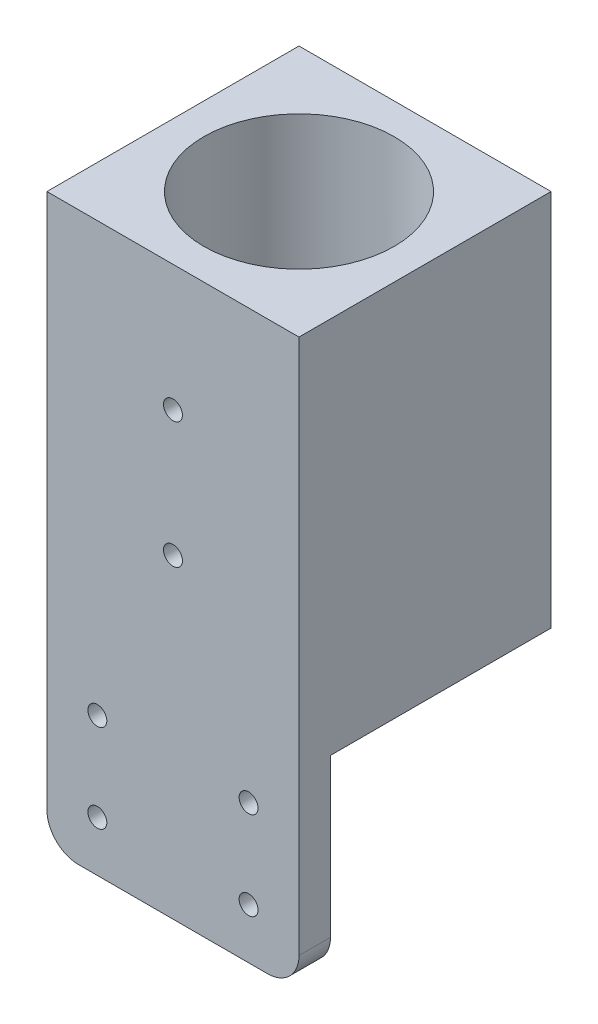
ISO-10303-21;
HEADER;
FILE_DESCRIPTION(('STEP AP214'),'2;1');
FILE_NAME('part.step','',(''),(''),'','','');
FILE_SCHEMA(('AUTOMOTIVE_DESIGN { 1 0 10303 214 1 1 1 1 }'));
ENDSEC;
DATA;
#1=APPLICATION_CONTEXT('core data for automotive mechanical design processes');
#2=APPLICATION_PROTOCOL_DEFINITION('international standard','automotive_design',2000,#1);
#3=PRODUCT_CONTEXT('',#1,'mechanical');
#4=PRODUCT('Part','Part','',(#3));
#5=PRODUCT_RELATED_PRODUCT_CATEGORY('part','',(#4));
#6=PRODUCT_DEFINITION_FORMATION('','',#4);
#7=PRODUCT_DEFINITION_CONTEXT('part definition',#1,'design');
#8=PRODUCT_DEFINITION('design','',#6,#7);
#9=PRODUCT_DEFINITION_SHAPE('','',#8);
#10=(LENGTH_UNIT() NAMED_UNIT(*) SI_UNIT(.MILLI.,.METRE.));
#11=(NAMED_UNIT(*) PLANE_ANGLE_UNIT() SI_UNIT($,.RADIAN.));
#12=(NAMED_UNIT(*) SI_UNIT($,.STERADIAN.) SOLID_ANGLE_UNIT());
#13=UNCERTAINTY_MEASURE_WITH_UNIT(LENGTH_MEASURE(1.E-05),#10,'distance_accuracy_value','');
#14=(GEOMETRIC_REPRESENTATION_CONTEXT(3) GLOBAL_UNCERTAINTY_ASSIGNED_CONTEXT((#13)) GLOBAL_UNIT_ASSIGNED_CONTEXT((#10,
#11,#12)) REPRESENTATION_CONTEXT('',''));
#15=CARTESIAN_POINT('',(0.,0.,0.));
#16=DIRECTION('',(0.,0.,1.));
#17=DIRECTION('',(1.,0.,0.));
#18=AXIS2_PLACEMENT_3D('',#15,#16,#17);
#19=CARTESIAN_POINT('',(20.,60.,-20.));
#20=DIRECTION('',(-1.,0.,0.));
#21=DIRECTION('',(0.,0.,1.));
#22=AXIS2_PLACEMENT_3D('',#19,#20,#21);
#23=PLANE('',#22);
#24=DIRECTION('',(0.,-1.,0.));
#25=VECTOR('',#24,1.);
#26=CARTESIAN_POINT('',(20.,60.,20.));
#27=LINE('',#26,#25);
#28=CARTESIAN_POINT('',(20.,60.,20.));
#29=VERTEX_POINT('',#28);
#30=CARTESIAN_POINT('',(20.,-25.,20.));
#31=VERTEX_POINT('',#30);
#32=EDGE_CURVE('E142',#29,#31,#27,.T.);
#33=ORIENTED_EDGE('',*,*,#32,.T.);
#34=DIRECTION('',(0.,0.,1.));
#35=VECTOR('',#34,1.);
#36=CARTESIAN_POINT('',(20.,-25.,15.));
#37=LINE('',#36,#35);
#38=CARTESIAN_POINT('',(20.,-25.,15.));
#39=VERTEX_POINT('',#38);
#40=EDGE_CURVE('E68',#31,#39,#37,.F.);
#41=ORIENTED_EDGE('',*,*,#40,.T.);
#42=DIRECTION('',(0.,1.,0.));
#43=VECTOR('',#42,1.);
#44=CARTESIAN_POINT('',(20.,0.,15.));
#45=LINE('',#44,#43);
#46=CARTESIAN_POINT('',(20.,0.,15.));
#47=VERTEX_POINT('',#46);
#48=EDGE_CURVE('E109',#39,#47,#45,.T.);
#49=ORIENTED_EDGE('',*,*,#48,.T.);
#50=DIRECTION('',(0.,0.,-1.));
#51=VECTOR('',#50,1.);
#52=CARTESIAN_POINT('',(20.,0.,-20.));
#53=LINE('',#52,#51);
#54=CARTESIAN_POINT('',(20.,0.,-20.));
#55=VERTEX_POINT('',#54);
#56=EDGE_CURVE('E113',#47,#55,#53,.T.);
#57=ORIENTED_EDGE('',*,*,#56,.T.);
#58=DIRECTION('',(0.,-1.,0.));
#59=VECTOR('',#58,1.);
#60=CARTESIAN_POINT('',(20.,60.,-20.));
#61=LINE('',#60,#59);
#62=CARTESIAN_POINT('',(20.,60.,-20.));
#63=VERTEX_POINT('',#62);
#64=EDGE_CURVE('E150',#63,#55,#61,.T.);
#65=ORIENTED_EDGE('',*,*,#64,.F.);
#66=DIRECTION('',(0.,0.,-1.));
#67=VECTOR('',#66,1.);
#68=CARTESIAN_POINT('',(20.,60.,-20.));
#69=LINE('',#68,#67);
#70=EDGE_CURVE('E141',#29,#63,#69,.T.);
#71=ORIENTED_EDGE('',*,*,#70,.F.);
#72=EDGE_LOOP('',(#33,#41,#49,#57,#65,#71));
#73=FACE_BOUND('',#72,.T.);
#74=ADVANCED_FACE('F38',(#73),#23,.F.);
#75=CARTESIAN_POINT('',(-20.,60.,-20.));
#76=DIRECTION('',(0.,0.,1.));
#77=DIRECTION('',(1.,0.,0.));
#78=AXIS2_PLACEMENT_3D('',#75,#76,#77);
#79=PLANE('',#78);
#80=CARTESIAN_POINT('',(0.,40.,-20.));
#81=DIRECTION('',(0.,0.,-1.));
#82=DIRECTION('',(-1.,0.,0.));
#83=AXIS2_PLACEMENT_3D('',#80,#81,#82);
#84=CIRCLE('',#83,1.5);
#85=CARTESIAN_POINT('',(-1.5,40.,-20.));
#86=VERTEX_POINT('',#85);
#87=EDGE_CURVE('E331',#86,#86,#84,.T.);
#88=ORIENTED_EDGE('',*,*,#87,.F.);
#89=EDGE_LOOP('',(#88));
#90=FACE_BOUND('',#89,.T.);
#91=CARTESIAN_POINT('',(0.,20.,-20.));
#92=DIRECTION('',(0.,0.,-1.));
#93=DIRECTION('',(-1.,0.,0.));
#94=AXIS2_PLACEMENT_3D('',#91,#92,#93);
#95=CIRCLE('',#94,1.5);
#96=CARTESIAN_POINT('',(-1.5,20.,-20.));
#97=VERTEX_POINT('',#96);
#98=EDGE_CURVE('E324',#97,#97,#95,.T.);
#99=ORIENTED_EDGE('',*,*,#98,.F.);
#100=EDGE_LOOP('',(#99));
#101=FACE_BOUND('',#100,.T.);
#102=DIRECTION('',(-1.,0.,0.));
#103=VECTOR('',#102,1.);
#104=CARTESIAN_POINT('',(-20.,0.,-20.));
#105=LINE('',#104,#103);
#106=CARTESIAN_POINT('',(-20.,0.,-20.));
#107=VERTEX_POINT('',#106);
#108=EDGE_CURVE('E128',#55,#107,#105,.T.);
#109=ORIENTED_EDGE('',*,*,#108,.T.);
#110=DIRECTION('',(0.,-1.,0.));
#111=VECTOR('',#110,1.);
#112=CARTESIAN_POINT('',(-20.,60.,-20.));
#113=LINE('',#112,#111);
#114=CARTESIAN_POINT('',(-20.,60.,-20.));
#115=VERTEX_POINT('',#114);
#116=EDGE_CURVE('E147',#115,#107,#113,.T.);
#117=ORIENTED_EDGE('',*,*,#116,.F.);
#118=DIRECTION('',(-1.,0.,0.));
#119=VECTOR('',#118,1.);
#120=CARTESIAN_POINT('',(-20.,60.,-20.));
#121=LINE('',#120,#119);
#122=EDGE_CURVE('E252',#63,#115,#121,.T.);
#123=ORIENTED_EDGE('',*,*,#122,.F.);
#124=ORIENTED_EDGE('',*,*,#64,.T.);
#125=EDGE_LOOP('',(#109,#117,#123,#124));
#126=FACE_BOUND('',#125,.T.);
#127=ADVANCED_FACE('F221',(#90,#101,#126),#79,.F.);
#128=CARTESIAN_POINT('',(-20.,60.,-20.));
#129=DIRECTION('',(1.,0.,0.));
#130=DIRECTION('',(0.,0.,-1.));
#131=AXIS2_PLACEMENT_3D('',#128,#129,#130);
#132=PLANE('',#131);
#133=DIRECTION('',(0.,-1.,0.));
#134=VECTOR('',#133,1.);
#135=CARTESIAN_POINT('',(-20.,0.,15.));
#136=LINE('',#135,#134);
#137=CARTESIAN_POINT('',(-20.,0.,15.));
#138=VERTEX_POINT('',#137);
#139=CARTESIAN_POINT('',(-20.,-25.,15.));
#140=VERTEX_POINT('',#139);
#141=EDGE_CURVE('E121',#138,#140,#136,.T.);
#142=ORIENTED_EDGE('',*,*,#141,.T.);
#143=DIRECTION('',(0.,0.,1.));
#144=VECTOR('',#143,1.);
#145=CARTESIAN_POINT('',(-20.,-25.,20.));
#146=LINE('',#145,#144);
#147=CARTESIAN_POINT('',(-20.,-25.,20.));
#148=VERTEX_POINT('',#147);
#149=EDGE_CURVE('E11',#140,#148,#146,.T.);
#150=ORIENTED_EDGE('',*,*,#149,.T.);
#151=DIRECTION('',(0.,-1.,0.));
#152=VECTOR('',#151,1.);
#153=CARTESIAN_POINT('',(-20.,60.,20.));
#154=LINE('',#153,#152);
#155=CARTESIAN_POINT('',(-20.,60.,20.));
#156=VERTEX_POINT('',#155);
#157=EDGE_CURVE('E144',#156,#148,#154,.T.);
#158=ORIENTED_EDGE('',*,*,#157,.F.);
#159=DIRECTION('',(0.,0.,1.));
#160=VECTOR('',#159,1.);
#161=CARTESIAN_POINT('',(-20.,60.,-20.));
#162=LINE('',#161,#160);
#163=EDGE_CURVE('E253',#115,#156,#162,.T.);
#164=ORIENTED_EDGE('',*,*,#163,.F.);
#165=ORIENTED_EDGE('',*,*,#116,.T.);
#166=DIRECTION('',(0.,0.,1.));
#167=VECTOR('',#166,1.);
#168=CARTESIAN_POINT('',(-20.,0.,-20.));
#169=LINE('',#168,#167);
#170=EDGE_CURVE('E132',#107,#138,#169,.T.);
#171=ORIENTED_EDGE('',*,*,#170,.T.);
#172=EDGE_LOOP('',(#142,#150,#158,#164,#165,#171));
#173=FACE_BOUND('',#172,.T.);
#174=ADVANCED_FACE('F226',(#173),#132,.F.);
#175=CARTESIAN_POINT('',(-20.,60.,20.));
#176=DIRECTION('',(0.,0.,-1.));
#177=DIRECTION('',(-1.,0.,0.));
#178=AXIS2_PLACEMENT_3D('',#175,#176,#177);
#179=PLANE('',#178);
#180=CARTESIAN_POINT('',(0.,40.,20.));
#181=DIRECTION('',(0.,0.,-1.));
#182=DIRECTION('',(-1.,0.,0.));
#183=AXIS2_PLACEMENT_3D('',#180,#181,#182);
#184=CIRCLE('',#183,1.5);
#185=CARTESIAN_POINT('',(-1.5,40.,20.));
#186=VERTEX_POINT('',#185);
#187=EDGE_CURVE('E321',#186,#186,#184,.T.);
#188=ORIENTED_EDGE('',*,*,#187,.T.);
#189=EDGE_LOOP('',(#188));
#190=FACE_BOUND('',#189,.T.);
#191=CARTESIAN_POINT('',(0.,20.,20.));
#192=DIRECTION('',(0.,0.,-1.));
#193=DIRECTION('',(-1.,0.,0.));
#194=AXIS2_PLACEMENT_3D('',#191,#192,#193);
#195=CIRCLE('',#194,1.5);
#196=CARTESIAN_POINT('',(-1.5,20.,20.));
#197=VERTEX_POINT('',#196);
#198=EDGE_CURVE('E172',#197,#197,#195,.T.);
#199=ORIENTED_EDGE('',*,*,#198,.T.);
#200=EDGE_LOOP('',(#199));
#201=FACE_BOUND('',#200,.T.);
#202=DIRECTION('',(1.,0.,0.));
#203=VECTOR('',#202,1.);
#204=CARTESIAN_POINT('',(-20.,-30.,20.));
#205=LINE('',#204,#203);
#206=CARTESIAN_POINT('',(-15.,-30.,20.));
#207=VERTEX_POINT('',#206);
#208=CARTESIAN_POINT('',(15.,-30.,20.));
#209=VERTEX_POINT('',#208);
#210=EDGE_CURVE('E242',#207,#209,#205,.T.);
#211=ORIENTED_EDGE('',*,*,#210,.T.);
#212=CARTESIAN_POINT('',(15.,-25.,20.));
#213=DIRECTION('',(0.,0.,-1.));
#214=DIRECTION('',(-1.,0.,0.));
#215=AXIS2_PLACEMENT_3D('',#212,#213,#214);
#216=CIRCLE('',#215,5.);
#217=EDGE_CURVE('E159',#209,#31,#216,.F.);
#218=ORIENTED_EDGE('',*,*,#217,.T.);
#219=ORIENTED_EDGE('',*,*,#32,.F.);
#220=DIRECTION('',(1.,0.,0.));
#221=VECTOR('',#220,1.);
#222=CARTESIAN_POINT('',(-20.,60.,20.));
#223=LINE('',#222,#221);
#224=EDGE_CURVE('E137',#156,#29,#223,.T.);
#225=ORIENTED_EDGE('',*,*,#224,.F.);
#226=ORIENTED_EDGE('',*,*,#157,.T.);
#227=CARTESIAN_POINT('',(-15.,-25.,20.));
#228=DIRECTION('',(0.,0.,-1.));
#229=DIRECTION('',(-1.,0.,0.));
#230=AXIS2_PLACEMENT_3D('',#227,#228,#229);
#231=CIRCLE('',#230,5.);
#232=EDGE_CURVE('E157',#148,#207,#231,.F.);
#233=ORIENTED_EDGE('',*,*,#232,.T.);
#234=EDGE_LOOP('',(#211,#218,#219,#225,#226,#233));
#235=FACE_BOUND('',#234,.T.);
#236=CARTESIAN_POINT('',(12.,-8.,20.));
#237=DIRECTION('',(0.,0.,1.));
#238=DIRECTION('',(-1.,0.,0.));
#239=AXIS2_PLACEMENT_3D('',#236,#237,#238);
#240=CIRCLE('',#239,1.5);
#241=CARTESIAN_POINT('',(10.5,-8.,20.));
#242=VERTEX_POINT('',#241);
#243=EDGE_CURVE('E345',#242,#242,#240,.T.);
#244=ORIENTED_EDGE('',*,*,#243,.F.);
#245=EDGE_LOOP('',(#244));
#246=FACE_BOUND('',#245,.T.);
#247=CARTESIAN_POINT('',(12.,-22.,20.));
#248=DIRECTION('',(0.,0.,1.));
#249=DIRECTION('',(-1.,0.,0.));
#250=AXIS2_PLACEMENT_3D('',#247,#248,#249);
#251=CIRCLE('',#250,1.5);
#252=CARTESIAN_POINT('',(10.5,-22.,20.));
#253=VERTEX_POINT('',#252);
#254=EDGE_CURVE('E344',#253,#253,#251,.T.);
#255=ORIENTED_EDGE('',*,*,#254,.F.);
#256=EDGE_LOOP('',(#255));
#257=FACE_BOUND('',#256,.T.);
#258=CARTESIAN_POINT('',(-12.,-22.,20.));
#259=DIRECTION('',(0.,0.,1.));
#260=DIRECTION('',(1.,0.,0.));
#261=AXIS2_PLACEMENT_3D('',#258,#259,#260);
#262=CIRCLE('',#261,1.5);
#263=CARTESIAN_POINT('',(-10.5,-22.,20.));
#264=VERTEX_POINT('',#263);
#265=EDGE_CURVE('E351',#264,#264,#262,.T.);
#266=ORIENTED_EDGE('',*,*,#265,.F.);
#267=EDGE_LOOP('',(#266));
#268=FACE_BOUND('',#267,.T.);
#269=CARTESIAN_POINT('',(-12.,-8.,20.));
#270=DIRECTION('',(0.,0.,1.));
#271=DIRECTION('',(1.,0.,0.));
#272=AXIS2_PLACEMENT_3D('',#269,#270,#271);
#273=CIRCLE('',#272,1.5);
#274=CARTESIAN_POINT('',(-10.5,-8.,20.));
#275=VERTEX_POINT('',#274);
#276=EDGE_CURVE('E357',#275,#275,#273,.T.);
#277=ORIENTED_EDGE('',*,*,#276,.F.);
#278=EDGE_LOOP('',(#277));
#279=FACE_BOUND('',#278,.T.);
#280=ADVANCED_FACE('F262',(#190,#201,#235,#246,#257,#268,#279),#179,.F.);
#281=CARTESIAN_POINT('',(0.,60.,0.));
#282=DIRECTION('',(0.,1.,0.));
#283=DIRECTION('',(0.,0.,1.));
#284=AXIS2_PLACEMENT_3D('',#281,#282,#283);
#285=PLANE('',#284);
#286=CARTESIAN_POINT('',(0.,60.,0.));
#287=DIRECTION('',(0.,1.,0.));
#288=DIRECTION('',(0.,0.,1.));
#289=AXIS2_PLACEMENT_3D('',#286,#287,#288);
#290=CIRCLE('',#289,15.1);
#291=CARTESIAN_POINT('',(0.,60.,15.1));
#292=VERTEX_POINT('',#291);
#293=EDGE_CURVE('E125',#292,#292,#290,.T.);
#294=ORIENTED_EDGE('',*,*,#293,.F.);
#295=EDGE_LOOP('',(#294));
#296=FACE_BOUND('',#295,.T.);
#297=ORIENTED_EDGE('',*,*,#70,.T.);
#298=ORIENTED_EDGE('',*,*,#122,.T.);
#299=ORIENTED_EDGE('',*,*,#163,.T.);
#300=ORIENTED_EDGE('',*,*,#224,.T.);
#301=EDGE_LOOP('',(#297,#298,#299,#300));
#302=FACE_BOUND('',#301,.T.);
#303=ADVANCED_FACE('F259',(#296,#302),#285,.T.);
#304=CARTESIAN_POINT('',(0.,0.,0.));
#305=DIRECTION('',(0.,1.,0.));
#306=DIRECTION('',(0.,0.,1.));
#307=AXIS2_PLACEMENT_3D('',#304,#305,#306);
#308=PLANE('',#307);
#309=ORIENTED_EDGE('',*,*,#56,.F.);
#310=DIRECTION('',(-1.,0.,0.));
#311=VECTOR('',#310,1.);
#312=CARTESIAN_POINT('',(-20.,0.,15.));
#313=LINE('',#312,#311);
#314=EDGE_CURVE('E116',#47,#138,#313,.T.);
#315=ORIENTED_EDGE('',*,*,#314,.T.);
#316=ORIENTED_EDGE('',*,*,#170,.F.);
#317=ORIENTED_EDGE('',*,*,#108,.F.);
#318=EDGE_LOOP('',(#309,#315,#316,#317));
#319=FACE_BOUND('',#318,.T.);
#320=ADVANCED_FACE('F127',(#319),#308,.F.);
#321=CARTESIAN_POINT('',(0.,9.99999999999999,0.));
#322=DIRECTION('',(0.,1.,0.));
#323=DIRECTION('',(0.,0.,1.));
#324=AXIS2_PLACEMENT_3D('',#321,#322,#323);
#325=CYLINDRICAL_SURFACE('',#324,15.1);
#326=CARTESIAN_POINT('',(0.,38.5,15.1));
#327=CARTESIAN_POINT('',(0.0840334913134179,38.5000036404221,15.0999990385374));
#328=CARTESIAN_POINT('',(0.168122612271099,38.5070854017001,15.0992910588697));
#329=CARTESIAN_POINT('',(0.333969778942404,38.5352291424973,15.0965348658164));
#330=CARTESIAN_POINT('',(0.415725149462323,38.5563065430931,15.0944851741027));
#331=CARTESIAN_POINT('',(0.574479156345273,38.6118220900159,15.0892769412067));
#332=CARTESIAN_POINT('',(0.65148062540209,38.6462521890749,15.0861190680008));
#333=CARTESIAN_POINT('',(0.798594736012719,38.7274802225141,15.079047622128));
#334=CARTESIAN_POINT('',(0.868708748074065,38.774275689493,15.0751342002662));
#335=CARTESIAN_POINT('',(1.00032367741318,38.8790846150748,15.0669745163323));
#336=CARTESIAN_POINT('',(1.06179668932916,38.9371330405989,15.0627272419762));
#337=CARTESIAN_POINT('',(1.1741448027792,39.0627255534249,15.0543869234307));
#338=CARTESIAN_POINT('',(1.22501941520662,39.1302700787224,15.0502938863663));
#339=CARTESIAN_POINT('',(1.31482520757763,39.2731118324098,15.0427150913587));
#340=CARTESIAN_POINT('',(1.35373117004318,39.348424989481,15.0392306222273));
#341=CARTESIAN_POINT('',(1.41833423838203,39.5045556682962,15.0332759806482));
#342=CARTESIAN_POINT('',(1.4440316665615,39.5853730556749,15.0308057834512));
#343=CARTESIAN_POINT('',(1.48140556837627,39.7499337344833,15.0271684823504));
#344=CARTESIAN_POINT('',(1.49312828444902,39.8336664270807,15.0259970816232));
#345=CARTESIAN_POINT('',(1.50236293710448,40.001918422725,15.0250766488671));
#346=CARTESIAN_POINT('',(1.49987524258122,40.0864377052958,15.0253275799154));
#347=CARTESIAN_POINT('',(1.48079780989317,40.2535450039719,15.0272195363062));
#348=CARTESIAN_POINT('',(1.46425855235936,40.3361388473433,15.0288555854999));
#349=CARTESIAN_POINT('',(1.41762602385058,40.4973725739407,15.0333256610411));
#350=CARTESIAN_POINT('',(1.38753257195448,40.5760124043729,15.0361597033794));
#351=CARTESIAN_POINT('',(1.31459014210282,40.7272653329698,15.0427121640719));
#352=CARTESIAN_POINT('',(1.27171875672147,40.7998675551162,15.0464321336688));
#353=CARTESIAN_POINT('',(1.17445352525687,40.9368653451612,15.0543359823205));
#354=CARTESIAN_POINT('',(1.12005934640686,41.001260675967,15.0585198747712));
#355=CARTESIAN_POINT('',(1.00101058139794,41.1203100847149,15.0669023190288));
#356=CARTESIAN_POINT('',(0.936312397049685,41.1749205752739,15.0711008554459));
#357=CARTESIAN_POINT('',(0.798643586722281,41.2725123113185,15.0790223240295));
#358=CARTESIAN_POINT('',(0.725672951653204,41.3154935440254,15.0827452556733));
#359=CARTESIAN_POINT('',(0.573500490253151,41.3886048950031,15.0892972400823));
#360=CARTESIAN_POINT('',(0.494297600223146,41.4187328138565,15.0921261398421));
#361=CARTESIAN_POINT('',(0.331923094472873,41.465250432226,15.0965697472753));
#362=CARTESIAN_POINT('',(0.248751595941156,41.4816405371393,15.0981844907777));
#363=CARTESIAN_POINT('',(0.0811782907909115,41.5001620044192,15.1000132436603));
#364=CARTESIAN_POINT('',(-0.00321680580619617,41.5023535167337,15.1002331618995));
#365=CARTESIAN_POINT('',(-0.17117309714296,41.4925735544574,15.0992633266477));
#366=CARTESIAN_POINT('',(-0.254734302982333,41.4806022686384,15.0980735919457));
#367=CARTESIAN_POINT('',(-0.418477297188524,41.4428864297211,15.094421935124));
#368=CARTESIAN_POINT('',(-0.498665632696482,41.4171700279009,15.0919626135869));
#369=CARTESIAN_POINT('',(-0.653590115846393,41.352722874355,15.0860477033924));
#370=CARTESIAN_POINT('',(-0.728326142734376,41.3139918344966,15.0825920926784));
#371=CARTESIAN_POINT('',(-0.870496559732581,41.2244655796339,15.0750564574029));
#372=CARTESIAN_POINT('',(-0.937905945929514,41.1736308312894,15.0709744026046));
#373=CARTESIAN_POINT('',(-1.06325650508847,41.0613968742776,15.0626504847039));
#374=CARTESIAN_POINT('',(-1.12119744352501,40.9999974040082,15.0584086176461));
#375=CARTESIAN_POINT('',(-1.22617511515132,40.8681145192309,15.0502253959363));
#376=CARTESIAN_POINT('',(-1.27317238166337,40.7975996102185,15.0462851623372));
#377=CARTESIAN_POINT('',(-1.35465734674598,40.6496429121308,15.0391683148233));
#378=CARTESIAN_POINT('',(-1.38914521442673,40.5722012167141,15.0359916905858));
#379=CARTESIAN_POINT('',(-1.44456627768245,40.4127247712406,15.0307686796749));
#380=CARTESIAN_POINT('',(-1.46552298521954,40.3306982588719,15.0287203334026));
#381=CARTESIAN_POINT('',(-1.49336314220043,40.1642693006581,15.0259796800411));
#382=CARTESIAN_POINT('',(-1.50024698946219,40.0798669220435,15.02528733462));
#383=CARTESIAN_POINT('',(-1.49974053707664,39.9114743785095,15.0253378642764));
#384=CARTESIAN_POINT('',(-1.49241223531713,39.827484018372,15.0260745056653));
#385=CARTESIAN_POINT('',(-1.46381946909954,39.6619338532663,15.0288867174114));
#386=CARTESIAN_POINT('',(-1.44255498869214,39.5803740510799,15.0309622893009));
#387=CARTESIAN_POINT('',(-1.38671053047343,39.4220004570126,15.0362167706571));
#388=CARTESIAN_POINT('',(-1.35213234173957,39.3451860290637,15.0393955318731));
#389=CARTESIAN_POINT('',(-1.27064843524865,39.1984414238663,15.0464985217679));
#390=CARTESIAN_POINT('',(-1.22374279185676,39.1285112050923,15.0504227459497));
#391=CARTESIAN_POINT('',(-1.1187026177464,38.9972023631535,15.0585949976822));
#392=CARTESIAN_POINT('',(-1.06052189971375,38.9358607666275,15.0628443120482));
#393=CARTESIAN_POINT('',(-0.934674232976564,38.8237838169193,15.071176202781));
#394=CARTESIAN_POINT('',(-0.867005014379293,38.7730510088878,15.0752587389475));
#395=CARTESIAN_POINT('',(-0.72391737866919,38.6835327851689,15.0828076107449));
#396=CARTESIAN_POINT('',(-0.648480091437878,38.6447774234414,15.0862723872249));
#397=CARTESIAN_POINT('',(-0.492182552368615,38.5805354303454,15.0921783482185));
#398=CARTESIAN_POINT('',(-0.411328537093085,38.5550338258457,15.094620687198));
#399=CARTESIAN_POINT('',(-0.275013323678494,38.5243879414083,15.0975923352258));
#400=CARTESIAN_POINT('',(-0.220423739200682,38.5152549446227,15.0984910035701));
#401=CARTESIAN_POINT('',(-0.110564129872748,38.5030597885313,15.0996951510757));
#402=CARTESIAN_POINT('',(-0.0552941077837321,38.4999976045992,15.1000006326432));
#403=CARTESIAN_POINT('',(0.,38.5,15.1));
#404=B_SPLINE_CURVE_WITH_KNOTS('',3,(#326,#327,#328,#329,#330,#331,#332,#333,#334,#335,#336,
#337,#338,#339,#340,#341,#342,#343,#344,#345,#346,#347,#348,#349,#350,#351,#352,#353,#354,#355,
#356,#357,#358,#359,#360,#361,#362,#363,#364,#365,#366,#367,#368,#369,#370,#371,#372,#373,#374,
#375,#376,#377,#378,#379,#380,#381,#382,#383,#384,#385,#386,#387,#388,#389,#390,#391,#392,#393,
#394,#395,#396,#397,#398,#399,#400,#401,#402,#403),.UNSPECIFIED.,.T.,.F.,(4,2,2,2,2,2,2,2,2,2,2,
2,2,2,2,2,2,2,2,2,2,2,2,2,2,2,2,2,2,2,2,2,2,2,2,2,2,2,4),(0.,0.251898561752107,
0.504075139190921,0.756099973007817,1.00807455539026,1.26084503944546,1.5136271860493,
1.7669383435121,2.0202433195452,2.27270775987047,2.52516564639505,2.7767203875183,
3.02827848648904,3.28028034030049,3.53228947266614,3.78539470806764,4.03850022158875,
4.29164902834897,4.54479036452968,4.79685860493316,5.04892348563007,5.30047408114897,
5.55203024614672,5.80441960023737,6.05681520485256,6.31010740602286,6.56339618289677,
6.81624364816236,7.06908396572312,7.32082379450776,7.57256391139745,7.82427021160308,
8.07597499342963,8.32873352994787,8.58155263628128,8.83500106334172,9.08816253697278,
9.25391267430062,9.41966213926263),.UNSPECIFIED.);
#405=CARTESIAN_POINT('',(0.,38.5,15.1));
#406=VERTEX_POINT('',#405);
#407=EDGE_CURVE('E42',#406,#406,#404,.T.);
#408=ORIENTED_EDGE('',*,*,#407,.T.);
#409=EDGE_LOOP('',(#408));
#410=FACE_BOUND('',#409,.T.);
#411=CARTESIAN_POINT('',(-1.5,40.,-15.0253119767944));
#412=CARTESIAN_POINT('',(-1.49999635854613,40.0840323379081,-15.025312956074));
#413=CARTESIAN_POINT('',(-1.49291478510043,40.1681203090886,-15.0260245276725));
#414=CARTESIAN_POINT('',(-1.46477185820528,40.3339650868479,-15.028793551497));
#415=CARTESIAN_POINT('',(-1.44369507968879,40.4157192173295,-15.03085248871));
#416=CARTESIAN_POINT('',(-1.38818135253405,40.5744706021013,-15.0360807748948));
#417=CARTESIAN_POINT('',(-1.35375248074173,40.6514706995853,-15.0392494524589));
#418=CARTESIAN_POINT('',(-1.27252733745513,40.798582511939,-15.0463393621317));
#419=CARTESIAN_POINT('',(-1.22573353035035,40.8686955956076,-15.05026044424));
#420=CARTESIAN_POINT('',(-1.12092628167147,41.0003115728581,-15.0584291270942));
#421=CARTESIAN_POINT('',(-1.06287750232365,41.0617862671161,-15.0626777301768));
#422=CARTESIAN_POINT('',(-0.937283575420636,41.1741376276325,-15.0710136412484));
#423=CARTESIAN_POINT('',(-0.869737994461098,41.2250138099448,-15.0751009418651));
#424=CARTESIAN_POINT('',(-0.726895315412322,41.3148212442856,-15.0826635983521));
#425=CARTESIAN_POINT('',(-0.651582470180895,41.3537275670679,-15.0861376707466));
#426=CARTESIAN_POINT('',(-0.495452469131726,41.4183313875751,-15.0920715347339));
#427=CARTESIAN_POINT('',(-0.414635445899538,41.4440292033412,-15.0945313507482));
#428=CARTESIAN_POINT('',(-0.250075883600478,41.4814039145561,-15.0981525138302));
#429=CARTESIAN_POINT('',(-0.166343950618247,41.4931270865079,-15.0993181456551));
#430=CARTESIAN_POINT('',(0.00190655759439105,41.5023629141085,-15.100234174601));
#431=CARTESIAN_POINT('',(0.0864251126221092,41.4998759337144,-15.0999846079687));
#432=CARTESIAN_POINT('',(0.25353556043428,41.4807996317617,-15.0981018679929));
#433=CARTESIAN_POINT('',(0.336133196401711,41.4642600719598,-15.0964735769364));
#434=CARTESIAN_POINT('',(0.49737435212394,41.4176256243436,-15.0920219994832));
#435=CARTESIAN_POINT('',(0.576017821082987,41.387530562443,-15.0891986977396));
#436=CARTESIAN_POINT('',(0.727275160741128,41.314584798763,-15.0826661343107));
#437=CARTESIAN_POINT('',(0.799878337650497,41.2717120651685,-15.0789553445811));
#438=CARTESIAN_POINT('',(0.936877465459624,41.1744439561001,-15.0710642123586));
#439=CARTESIAN_POINT('',(1.00127317876582,41.120048247175,-15.0668838562791));
#440=CARTESIAN_POINT('',(1.12032085957512,41.0009983967895,-15.0585014337633));
#441=CARTESIAN_POINT('',(1.17492954862421,40.9363009695517,-15.054299351531));
#442=CARTESIAN_POINT('',(1.27251801061355,40.798634315922,-15.0463651004589));
#443=CARTESIAN_POINT('',(1.31549776704826,40.7256650777897,-15.0426329322861));
#444=CARTESIAN_POINT('',(1.38860805601259,40.573492994915,-15.0360607178808));
#445=CARTESIAN_POINT('',(1.41873593323833,40.494288865993,-15.0332208560381));
#446=CARTESIAN_POINT('',(1.46525308871646,40.3319116673364,-15.0287585753405));
#447=CARTESIAN_POINT('',(1.48164277988374,40.2487387169679,-15.0271361198954));
#448=CARTESIAN_POINT('',(1.50016268663854,40.0811647363099,-15.0252986591232));
#449=CARTESIAN_POINT('',(1.50235344042828,39.9967704594153,-15.0250776785925));
#450=CARTESIAN_POINT('',(1.49257225368717,39.8288159897031,-15.0260524182927));
#451=CARTESIAN_POINT('',(1.48060050195128,39.7452557857818,-15.0272481196383));
#452=CARTESIAN_POINT('',(1.44288477969783,39.5815177761309,-15.0309160596127));
#453=CARTESIAN_POINT('',(1.41716941799686,39.5013333161148,-15.0333856461404));
#454=CARTESIAN_POINT('',(1.35272564260952,39.3464161237869,-15.0393209391003));
#455=CARTESIAN_POINT('',(1.31399693465547,39.2716835148031,-15.0427866680578));
#456=CARTESIAN_POINT('',(1.2244741127262,39.1295154277819,-15.0503382064572));
#457=CARTESIAN_POINT('',(1.17363987299589,39.0621053271485,-15.0544260614167));
#458=CARTESIAN_POINT('',(1.06140651663175,38.9367530895975,-15.0627545443571));
#459=CARTESIAN_POINT('',(1.00000714187558,38.8788111840697,-15.0669951760684));
#460=CARTESIAN_POINT('',(0.868123835144985,38.7738314209589,-15.0751694218504));
#461=CARTESIAN_POINT('',(0.797608391658787,38.7268330489097,-15.0791018911967));
#462=CARTESIAN_POINT('',(0.649650329668305,38.6453461441191,-15.0862000664518));
#463=CARTESIAN_POINT('',(0.572207805008103,38.610857441936,-15.0893657827459));
#464=CARTESIAN_POINT('',(0.412731881610149,38.5554358271819,-15.0945685839412));
#465=CARTESIAN_POINT('',(0.33070684694006,38.5344790410605,-15.0966076555916));
#466=CARTESIAN_POINT('',(0.164281005364228,38.5066382262014,-15.099335565752));
#467=CARTESIAN_POINT('',(0.0798802643504136,38.4997538075456,-15.1000244416734));
#468=CARTESIAN_POINT('',(-0.0885132586038646,38.5002585923235,-15.0999743264919));
#469=CARTESIAN_POINT('',(-0.172506232884099,38.5075864877595,-15.0992414683536));
#470=CARTESIAN_POINT('',(-0.338061727779915,38.5361793609014,-15.096442335095));
#471=CARTESIAN_POINT('',(-0.419624246419132,38.5574443499401,-15.0943760588904));
#472=CARTESIAN_POINT('',(-0.578003288244202,38.6132908511903,-15.0891416171645));
#473=CARTESIAN_POINT('',(-0.654820438508599,38.6478705995307,-15.0859735976019));
#474=CARTESIAN_POINT('',(-0.801569837575123,38.7293584680913,-15.078888864656));
#475=CARTESIAN_POINT('',(-0.871502129590264,38.7762665109258,-15.0749721559724));
#476=CARTESIAN_POINT('',(-1.00281085394436,38.8813093254985,-15.0668086636542));
#477=CARTESIAN_POINT('',(-1.06415069694839,38.9394897356781,-15.0625605816352));
#478=CARTESIAN_POINT('',(-1.17622425255196,39.0653360650132,-15.0542241088092));
#479=CARTESIAN_POINT('',(-1.22695541540431,39.1330042580001,-15.050135756584));
#480=CARTESIAN_POINT('',(-1.31647186691678,39.2760910566375,-15.042570630608));
#481=CARTESIAN_POINT('',(-1.35522680653066,39.3515287170159,-15.0390954200226));
#482=CARTESIAN_POINT('',(-1.41946790711139,39.5078270472788,-15.0331686996374));
#483=CARTESIAN_POINT('',(-1.444969046934,39.5886814781435,-15.0307160348248));
#484=CARTESIAN_POINT('',(-1.47561362318629,39.7249954485645,-15.0277311589647));
#485=CARTESIAN_POINT('',(-1.48474603116336,39.7795832819967,-15.0268282506956));
#486=CARTESIAN_POINT('',(-1.49694040505908,39.8894393833602,-15.0256183386627));
#487=CARTESIAN_POINT('',(-1.50000239603648,39.9447076484818,-15.0253113324391));
#488=CARTESIAN_POINT('',(-1.5,40.,-15.0253119767944));
#489=B_SPLINE_CURVE_WITH_KNOTS('',3,(#411,#412,#413,#414,#415,#416,#417,#418,#419,#420,#421,
#422,#423,#424,#425,#426,#427,#428,#429,#430,#431,#432,#433,#434,#435,#436,#437,#438,#439,#440,
#441,#442,#443,#444,#445,#446,#447,#448,#449,#450,#451,#452,#453,#454,#455,#456,#457,#458,#459,
#460,#461,#462,#463,#464,#465,#466,#467,#468,#469,#470,#471,#472,#473,#474,#475,#476,#477,#478,
#479,#480,#481,#482,#483,#484,#485,#486,#487,#488),.UNSPECIFIED.,.T.,.F.,(4,2,2,2,2,2,2,2,2,2,2,
2,2,2,2,2,2,2,2,2,2,2,2,2,2,2,2,2,2,2,2,2,2,2,2,2,2,2,4),(0.,0.251895097196481,0.50406828696038,
0.75608917138904,1.00805986471088,1.26083488254587,1.51362143998953,1.76693095868192,
2.02023437776912,2.27269664114699,2.52515243837155,2.77671796950038,3.02828673144791,
3.28029179364622,3.53230414935095,3.7854047994611,4.03850580880849,4.29165908560718,
4.54480475335873,4.79687040216313,5.04893269081456,5.30047231646477,5.552017630503,
5.80440863162633,6.05680579992193,6.310100003098,6.56339077531053,6.81623345189484,
7.06906912260185,7.32081655553195,7.57256419316888,7.82427849203737,8.07599121091297,
8.32874517901134,8.58155982571251,8.83500997565596,9.08817306120623,9.25391794111063,
9.41966213681694),.UNSPECIFIED.);
#490=CARTESIAN_POINT('',(-1.5,40.,-15.0253119767944));
#491=VERTEX_POINT('',#490);
#492=EDGE_CURVE('E325',#491,#491,#489,.T.);
#493=ORIENTED_EDGE('',*,*,#492,.T.);
#494=EDGE_LOOP('',(#493));
#495=FACE_BOUND('',#494,.T.);
#496=CARTESIAN_POINT('',(0.,18.5,15.1));
#497=CARTESIAN_POINT('',(0.0840334913134179,18.5000036404221,15.0999990385374));
#498=CARTESIAN_POINT('',(0.168122612271099,18.5070854017001,15.0992910588697));
#499=CARTESIAN_POINT('',(0.333969778942404,18.5352291424973,15.0965348658164));
#500=CARTESIAN_POINT('',(0.415725149462323,18.5563065430931,15.0944851741027));
#501=CARTESIAN_POINT('',(0.574479156345272,18.6118220900159,15.0892769412067));
#502=CARTESIAN_POINT('',(0.65148062540209,18.6462521890749,15.0861190680008));
#503=CARTESIAN_POINT('',(0.798594736012718,18.7274802225141,15.079047622128));
#504=CARTESIAN_POINT('',(0.868708748074066,18.774275689493,15.0751342002662));
#505=CARTESIAN_POINT('',(1.00032367741319,18.8790846150748,15.0669745163323));
#506=CARTESIAN_POINT('',(1.06179668932917,18.9371330405989,15.0627272419762));
#507=CARTESIAN_POINT('',(1.1741448027792,19.0627255534249,15.0543869234307));
#508=CARTESIAN_POINT('',(1.22501941520662,19.1302700787224,15.0502938863663));
#509=CARTESIAN_POINT('',(1.31482520757763,19.2731118324098,15.0427150913587));
#510=CARTESIAN_POINT('',(1.35373117004318,19.348424989481,15.0392306222273));
#511=CARTESIAN_POINT('',(1.41833423838203,19.5045556682962,15.0332759806482));
#512=CARTESIAN_POINT('',(1.4440316665615,19.5853730556749,15.0308057834512));
#513=CARTESIAN_POINT('',(1.48140556837627,19.7499337344833,15.0271684823504));
#514=CARTESIAN_POINT('',(1.49312828444902,19.8336664270807,15.0259970816232));
#515=CARTESIAN_POINT('',(1.50236293710448,20.001918422725,15.0250766488671));
#516=CARTESIAN_POINT('',(1.49987524258122,20.0864377052958,15.0253275799154));
#517=CARTESIAN_POINT('',(1.48079780989317,20.2535450039719,15.0272195363062));
#518=CARTESIAN_POINT('',(1.46425855235936,20.3361388473433,15.0288555854999));
#519=CARTESIAN_POINT('',(1.41762602385059,20.4973725739407,15.0333256610411));
#520=CARTESIAN_POINT('',(1.38753257195448,20.5760124043729,15.0361597033794));
#521=CARTESIAN_POINT('',(1.31459014210282,20.7272653329698,15.0427121640719));
#522=CARTESIAN_POINT('',(1.27171875672147,20.7998675551162,15.0464321336688));
#523=CARTESIAN_POINT('',(1.17445352525687,20.9368653451612,15.0543359823205));
#524=CARTESIAN_POINT('',(1.12005934640686,21.001260675967,15.0585198747712));
#525=CARTESIAN_POINT('',(1.00101058139794,21.1203100847149,15.0669023190288));
#526=CARTESIAN_POINT('',(0.936312397049684,21.1749205752739,15.0711008554459));
#527=CARTESIAN_POINT('',(0.798643586722277,21.2725123113185,15.0790223240295));
#528=CARTESIAN_POINT('',(0.7256729516532,21.3154935440254,15.0827452556733));
#529=CARTESIAN_POINT('',(0.573500490253146,21.3886048950031,15.0892972400823));
#530=CARTESIAN_POINT('',(0.494297600223142,21.4187328138565,15.0921261398421));
#531=CARTESIAN_POINT('',(0.33192309447287,21.465250432226,15.0965697472753));
#532=CARTESIAN_POINT('',(0.248751595941155,21.4816405371393,15.0981844907777));
#533=CARTESIAN_POINT('',(0.0811782907909112,21.5001620044192,15.1000132436603));
#534=CARTESIAN_POINT('',(-0.00321680580619642,21.5023535167337,15.1002331618995));
#535=CARTESIAN_POINT('',(-0.17117309714296,21.4925735544574,15.0992633266477));
#536=CARTESIAN_POINT('',(-0.254734302982333,21.4806022686384,15.0980735919457));
#537=CARTESIAN_POINT('',(-0.418477297188525,21.4428864297211,15.094421935124));
#538=CARTESIAN_POINT('',(-0.498665632696483,21.4171700279009,15.0919626135869));
#539=CARTESIAN_POINT('',(-0.653590115846393,21.352722874355,15.0860477033924));
#540=CARTESIAN_POINT('',(-0.728326142734376,21.3139918344966,15.0825920926784));
#541=CARTESIAN_POINT('',(-0.870496559732581,21.2244655796339,15.0750564574029));
#542=CARTESIAN_POINT('',(-0.937905945929515,21.1736308312894,15.0709744026046));
#543=CARTESIAN_POINT('',(-1.06325650508847,21.0613968742776,15.0626504847039));
#544=CARTESIAN_POINT('',(-1.12119744352501,20.9999974040082,15.0584086176461));
#545=CARTESIAN_POINT('',(-1.22617511515132,20.8681145192309,15.0502253959363));
#546=CARTESIAN_POINT('',(-1.27317238166337,20.7975996102185,15.0462851623372));
#547=CARTESIAN_POINT('',(-1.35465734674598,20.6496429121308,15.0391683148233));
#548=CARTESIAN_POINT('',(-1.38914521442673,20.5722012167141,15.0359916905858));
#549=CARTESIAN_POINT('',(-1.44456627768245,20.4127247712406,15.0307686796749));
#550=CARTESIAN_POINT('',(-1.46552298521954,20.3306982588719,15.0287203334026));
#551=CARTESIAN_POINT('',(-1.49336314220043,20.1642693006581,15.0259796800411));
#552=CARTESIAN_POINT('',(-1.50024698946219,20.0798669220435,15.02528733462));
#553=CARTESIAN_POINT('',(-1.49974053707664,19.9114743785095,15.0253378642764));
#554=CARTESIAN_POINT('',(-1.49241223531713,19.827484018372,15.0260745056653));
#555=CARTESIAN_POINT('',(-1.46381946909954,19.6619338532663,15.0288867174114));
#556=CARTESIAN_POINT('',(-1.44255498869214,19.5803740510799,15.0309622893009));
#557=CARTESIAN_POINT('',(-1.38671053047343,19.4220004570126,15.0362167706571));
#558=CARTESIAN_POINT('',(-1.35213234173957,19.3451860290637,15.0393955318731));
#559=CARTESIAN_POINT('',(-1.27064843524865,19.1984414238662,15.0464985217679));
#560=CARTESIAN_POINT('',(-1.22374279185675,19.1285112050923,15.0504227459497));
#561=CARTESIAN_POINT('',(-1.1187026177464,18.9972023631535,15.0585949976822));
#562=CARTESIAN_POINT('',(-1.06052189971374,18.9358607666275,15.0628443120482));
#563=CARTESIAN_POINT('',(-0.934674232976556,18.8237838169193,15.071176202781));
#564=CARTESIAN_POINT('',(-0.867005014379288,18.7730510088878,15.0752587389475));
#565=CARTESIAN_POINT('',(-0.723917378669187,18.6835327851689,15.0828076107449));
#566=CARTESIAN_POINT('',(-0.648480091437876,18.6447774234414,15.0862723872249));
#567=CARTESIAN_POINT('',(-0.492182552368614,18.5805354303454,15.0921783482185));
#568=CARTESIAN_POINT('',(-0.411328537093085,18.5550338258457,15.094620687198));
#569=CARTESIAN_POINT('',(-0.275013323678493,18.5243879414083,15.0975923352258));
#570=CARTESIAN_POINT('',(-0.220423739200681,18.5152549446227,15.0984910035701));
#571=CARTESIAN_POINT('',(-0.110564129872747,18.5030597885313,15.0996951510757));
#572=CARTESIAN_POINT('',(-0.0552941077837319,18.4999976045992,15.1000006326432));
#573=CARTESIAN_POINT('',(0.,18.5,15.1));
#574=B_SPLINE_CURVE_WITH_KNOTS('',3,(#496,#497,#498,#499,#500,#501,#502,#503,#504,#505,#506,
#507,#508,#509,#510,#511,#512,#513,#514,#515,#516,#517,#518,#519,#520,#521,#522,#523,#524,#525,
#526,#527,#528,#529,#530,#531,#532,#533,#534,#535,#536,#537,#538,#539,#540,#541,#542,#543,#544,
#545,#546,#547,#548,#549,#550,#551,#552,#553,#554,#555,#556,#557,#558,#559,#560,#561,#562,#563,
#564,#565,#566,#567,#568,#569,#570,#571,#572,#573),.UNSPECIFIED.,.T.,.F.,(4,2,2,2,2,2,2,2,2,2,2,
2,2,2,2,2,2,2,2,2,2,2,2,2,2,2,2,2,2,2,2,2,2,2,2,2,2,2,4),(0.,0.251898561752106,
0.504075139190921,0.756099973007817,1.00807455539027,1.26084503944547,1.5136271860493,
1.76693834351211,2.02024331954521,2.27270775987047,2.52516564639505,2.77672038751828,
3.02827848648903,3.28028034030048,3.53228947266614,3.78539470806764,4.03850022158876,
4.29164902834897,4.54479036452968,4.79685860493315,5.04892348563006,5.30047408114897,
5.55203024614672,5.80441960023737,6.05681520485256,6.31010740602286,6.56339618289678,
6.81624364816235,7.06908396572311,7.32082379450776,7.57256391139745,7.82427021160309,
8.07597499342963,8.32873352994788,8.58155263628128,8.83500106334171,9.08816253697278,
9.25391267430062,9.41966213926263),.UNSPECIFIED.);
#575=CARTESIAN_POINT('',(0.,18.5,15.1));
#576=VERTEX_POINT('',#575);
#577=EDGE_CURVE('E171',#576,#576,#574,.T.);
#578=ORIENTED_EDGE('',*,*,#577,.T.);
#579=EDGE_LOOP('',(#578));
#580=FACE_BOUND('',#579,.T.);
#581=CARTESIAN_POINT('',(-1.5,20.,-15.0253119767944));
#582=CARTESIAN_POINT('',(-1.49999635854613,20.0840323379081,-15.025312956074));
#583=CARTESIAN_POINT('',(-1.49291478510043,20.1681203090886,-15.0260245276725));
#584=CARTESIAN_POINT('',(-1.46477185820528,20.3339650868479,-15.028793551497));
#585=CARTESIAN_POINT('',(-1.44369507968879,20.4157192173295,-15.03085248871));
#586=CARTESIAN_POINT('',(-1.38818135253405,20.5744706021013,-15.0360807748948));
#587=CARTESIAN_POINT('',(-1.35375248074173,20.6514706995853,-15.0392494524589));
#588=CARTESIAN_POINT('',(-1.27252733745513,20.798582511939,-15.0463393621317));
#589=CARTESIAN_POINT('',(-1.22573353035035,20.8686955956076,-15.05026044424));
#590=CARTESIAN_POINT('',(-1.12092628167147,21.0003115728581,-15.0584291270942));
#591=CARTESIAN_POINT('',(-1.06287750232365,21.0617862671161,-15.0626777301768));
#592=CARTESIAN_POINT('',(-0.937283575420638,21.1741376276325,-15.0710136412484));
#593=CARTESIAN_POINT('',(-0.8697379944611,21.2250138099448,-15.0751009418651));
#594=CARTESIAN_POINT('',(-0.726895315412324,21.3148212442856,-15.0826635983521));
#595=CARTESIAN_POINT('',(-0.651582470180897,21.3537275670679,-15.0861376707466));
#596=CARTESIAN_POINT('',(-0.495452469131727,21.4183313875751,-15.0920715347339));
#597=CARTESIAN_POINT('',(-0.414635445899539,21.4440292033412,-15.0945313507482));
#598=CARTESIAN_POINT('',(-0.250075883600478,21.4814039145561,-15.0981525138302));
#599=CARTESIAN_POINT('',(-0.166343950618247,21.4931270865079,-15.0993181456551));
#600=CARTESIAN_POINT('',(0.00190655759439033,21.5023629141085,-15.100234174601));
#601=CARTESIAN_POINT('',(0.0864251126221085,21.4998759337144,-15.0999846079687));
#602=CARTESIAN_POINT('',(0.25353556043428,21.4807996317617,-15.0981018679929));
#603=CARTESIAN_POINT('',(0.336133196401712,21.4642600719598,-15.0964735769364));
#604=CARTESIAN_POINT('',(0.49737435212394,21.4176256243436,-15.0920219994832));
#605=CARTESIAN_POINT('',(0.576017821082988,21.387530562443,-15.0891986977396));
#606=CARTESIAN_POINT('',(0.727275160741129,21.314584798763,-15.0826661343107));
#607=CARTESIAN_POINT('',(0.799878337650499,21.2717120651685,-15.0789553445811));
#608=CARTESIAN_POINT('',(0.936877465459627,21.1744439561001,-15.0710642123586));
#609=CARTESIAN_POINT('',(1.00127317876582,21.120048247175,-15.0668838562791));
#610=CARTESIAN_POINT('',(1.12032085957513,21.0009983967894,-15.0585014337633));
#611=CARTESIAN_POINT('',(1.17492954862421,20.9363009695516,-15.054299351531));
#612=CARTESIAN_POINT('',(1.27251801061355,20.798634315922,-15.0463651004589));
#613=CARTESIAN_POINT('',(1.31549776704826,20.7256650777897,-15.0426329322861));
#614=CARTESIAN_POINT('',(1.38860805601259,20.573492994915,-15.0360607178808));
#615=CARTESIAN_POINT('',(1.41873593323833,20.494288865993,-15.0332208560381));
#616=CARTESIAN_POINT('',(1.46525308871646,20.3319116673364,-15.0287585753405));
#617=CARTESIAN_POINT('',(1.48164277988374,20.2487387169679,-15.0271361198954));
#618=CARTESIAN_POINT('',(1.50016268663854,20.0811647363099,-15.0252986591232));
#619=CARTESIAN_POINT('',(1.50235344042828,19.9967704594153,-15.0250776785925));
#620=CARTESIAN_POINT('',(1.49257225368717,19.8288159897031,-15.0260524182927));
#621=CARTESIAN_POINT('',(1.48060050195128,19.7452557857818,-15.0272481196383));
#622=CARTESIAN_POINT('',(1.44288477969783,19.5815177761309,-15.0309160596127));
#623=CARTESIAN_POINT('',(1.41716941799686,19.5013333161147,-15.0333856461404));
#624=CARTESIAN_POINT('',(1.35272564260952,19.3464161237869,-15.0393209391003));
#625=CARTESIAN_POINT('',(1.31399693465547,19.2716835148031,-15.0427866680578));
#626=CARTESIAN_POINT('',(1.2244741127262,19.1295154277819,-15.0503382064572));
#627=CARTESIAN_POINT('',(1.17363987299589,19.0621053271485,-15.0544260614167));
#628=CARTESIAN_POINT('',(1.06140651663175,18.9367530895975,-15.0627545443571));
#629=CARTESIAN_POINT('',(1.00000714187558,18.8788111840697,-15.0669951760684));
#630=CARTESIAN_POINT('',(0.86812383514498,18.7738314209589,-15.0751694218504));
#631=CARTESIAN_POINT('',(0.797608391658781,18.7268330489097,-15.0791018911967));
#632=CARTESIAN_POINT('',(0.649650329668298,18.6453461441191,-15.0862000664518));
#633=CARTESIAN_POINT('',(0.572207805008097,18.610857441936,-15.0893657827459));
#634=CARTESIAN_POINT('',(0.412731881610145,18.5554358271819,-15.0945685839412));
#635=CARTESIAN_POINT('',(0.330706846940057,18.5344790410605,-15.0966076555916));
#636=CARTESIAN_POINT('',(0.164281005364225,18.5066382262014,-15.099335565752));
#637=CARTESIAN_POINT('',(0.0798802643504099,18.4997538075456,-15.1000244416734));
#638=CARTESIAN_POINT('',(-0.0885132586038677,18.5002585923235,-15.0999743264919));
#639=CARTESIAN_POINT('',(-0.172506232884102,18.5075864877595,-15.0992414683536));
#640=CARTESIAN_POINT('',(-0.338061727779916,18.5361793609013,-15.096442335095));
#641=CARTESIAN_POINT('',(-0.419624246419134,18.5574443499401,-15.0943760588904));
#642=CARTESIAN_POINT('',(-0.578003288244203,18.6132908511903,-15.0891416171645));
#643=CARTESIAN_POINT('',(-0.6548204385086,18.6478705995307,-15.0859735976019));
#644=CARTESIAN_POINT('',(-0.801569837575123,18.7293584680913,-15.078888864656));
#645=CARTESIAN_POINT('',(-0.871502129590264,18.7762665109258,-15.0749721559724));
#646=CARTESIAN_POINT('',(-1.00281085394436,18.8813093254985,-15.0668086636542));
#647=CARTESIAN_POINT('',(-1.06415069694839,18.9394897356781,-15.0625605816352));
#648=CARTESIAN_POINT('',(-1.17622425255196,19.0653360650132,-15.0542241088092));
#649=CARTESIAN_POINT('',(-1.22695541540431,19.1330042580001,-15.050135756584));
#650=CARTESIAN_POINT('',(-1.31647186691678,19.2760910566375,-15.042570630608));
#651=CARTESIAN_POINT('',(-1.35522680653066,19.3515287170159,-15.0390954200226));
#652=CARTESIAN_POINT('',(-1.41946790711139,19.5078270472788,-15.0331686996374));
#653=CARTESIAN_POINT('',(-1.444969046934,19.5886814781435,-15.0307160348248));
#654=CARTESIAN_POINT('',(-1.47561362318629,19.7249954485645,-15.0277311589647));
#655=CARTESIAN_POINT('',(-1.48474603116336,19.7795832819967,-15.0268282506956));
#656=CARTESIAN_POINT('',(-1.49694040505908,19.8894393833602,-15.0256183386627));
#657=CARTESIAN_POINT('',(-1.50000239603648,19.9447076484818,-15.0253113324391));
#658=CARTESIAN_POINT('',(-1.5,20.,-15.0253119767944));
#659=B_SPLINE_CURVE_WITH_KNOTS('',3,(#581,#582,#583,#584,#585,#586,#587,#588,#589,#590,#591,
#592,#593,#594,#595,#596,#597,#598,#599,#600,#601,#602,#603,#604,#605,#606,#607,#608,#609,#610,
#611,#612,#613,#614,#615,#616,#617,#618,#619,#620,#621,#622,#623,#624,#625,#626,#627,#628,#629,
#630,#631,#632,#633,#634,#635,#636,#637,#638,#639,#640,#641,#642,#643,#644,#645,#646,#647,#648,
#649,#650,#651,#652,#653,#654,#655,#656,#657,#658),.UNSPECIFIED.,.T.,.F.,(4,2,2,2,2,2,2,2,2,2,2,
2,2,2,2,2,2,2,2,2,2,2,2,2,2,2,2,2,2,2,2,2,2,2,2,2,2,2,4),(0.,0.251895097196477,0.50406828696038,
0.756089171389044,1.00805986471088,1.26083488254587,1.51362143998953,1.76693095868192,
2.02023437776912,2.27269664114698,2.52515243837155,2.77671796950038,3.02828673144791,
3.28029179364623,3.53230414935096,3.7854047994611,4.03850580880848,4.29165908560718,
4.54480475335872,4.79687040216312,5.04893269081456,5.30047231646477,5.552017630503,
5.80440863162633,6.05680579992193,6.31010000309801,6.56339077531053,6.81623345189484,
7.06906912260185,7.32081655553195,7.57256419316888,7.82427849203737,8.07599121091297,
8.32874517901134,8.58155982571251,8.83500997565597,9.08817306120623,9.25391794111063,
9.41966213681694),.UNSPECIFIED.);
#660=CARTESIAN_POINT('',(-1.5,20.,-15.0253119767944));
#661=VERTEX_POINT('',#660);
#662=EDGE_CURVE('E164',#661,#661,#659,.T.);
#663=ORIENTED_EDGE('',*,*,#662,.T.);
#664=EDGE_LOOP('',(#663));
#665=FACE_BOUND('',#664,.T.);
#666=CARTESIAN_POINT('',(0.,9.99999999999999,0.));
#667=DIRECTION('',(0.,1.,0.));
#668=DIRECTION('',(0.,0.,1.));
#669=AXIS2_PLACEMENT_3D('',#666,#667,#668);
#670=CIRCLE('',#669,15.1);
#671=CARTESIAN_POINT('',(0.,9.99999999999999,15.1));
#672=VERTEX_POINT('',#671);
#673=EDGE_CURVE('E130',#672,#672,#670,.T.);
#674=ORIENTED_EDGE('',*,*,#673,.F.);
#675=EDGE_LOOP('',(#674));
#676=FACE_BOUND('',#675,.T.);
#677=ORIENTED_EDGE('',*,*,#293,.T.);
#678=EDGE_LOOP('',(#677));
#679=FACE_BOUND('',#678,.T.);
#680=ADVANCED_FACE('F176',(#410,#495,#580,#665,#676,#679),#325,.F.);
#681=CARTESIAN_POINT('',(0.,9.99999999999999,0.));
#682=DIRECTION('',(0.,1.,0.));
#683=DIRECTION('',(0.,0.,1.));
#684=AXIS2_PLACEMENT_3D('',#681,#682,#683);
#685=PLANE('',#684);
#686=ORIENTED_EDGE('',*,*,#673,.T.);
#687=EDGE_LOOP('',(#686));
#688=FACE_BOUND('',#687,.T.);
#689=ADVANCED_FACE('F212',(#688),#685,.T.);
#690=CARTESIAN_POINT('',(-20.,-30.,15.));
#691=DIRECTION('',(0.,-1.,0.));
#692=DIRECTION('',(0.,0.,-1.));
#693=AXIS2_PLACEMENT_3D('',#690,#691,#692);
#694=PLANE('',#693);
#695=DIRECTION('',(1.,0.,0.));
#696=VECTOR('',#695,1.);
#697=CARTESIAN_POINT('',(-20.,-30.,15.));
#698=LINE('',#697,#696);
#699=CARTESIAN_POINT('',(-15.,-30.,15.));
#700=VERTEX_POINT('',#699);
#701=CARTESIAN_POINT('',(15.,-30.,15.));
#702=VERTEX_POINT('',#701);
#703=EDGE_CURVE('E117',#700,#702,#698,.T.);
#704=ORIENTED_EDGE('',*,*,#703,.T.);
#705=DIRECTION('',(0.,0.,1.));
#706=VECTOR('',#705,1.);
#707=CARTESIAN_POINT('',(15.,-30.,20.));
#708=LINE('',#707,#706);
#709=EDGE_CURVE('E154',#702,#209,#708,.T.);
#710=ORIENTED_EDGE('',*,*,#709,.T.);
#711=ORIENTED_EDGE('',*,*,#210,.F.);
#712=DIRECTION('',(0.,0.,1.));
#713=VECTOR('',#712,1.);
#714=CARTESIAN_POINT('',(-15.,-30.,15.));
#715=LINE('',#714,#713);
#716=EDGE_CURVE('E152',#207,#700,#715,.F.);
#717=ORIENTED_EDGE('',*,*,#716,.T.);
#718=EDGE_LOOP('',(#704,#710,#711,#717));
#719=FACE_BOUND('',#718,.T.);
#720=ADVANCED_FACE('F209',(#719),#694,.T.);
#721=CARTESIAN_POINT('',(0.,0.,15.));
#722=DIRECTION('',(0.,0.,1.));
#723=DIRECTION('',(1.,0.,0.));
#724=AXIS2_PLACEMENT_3D('',#721,#722,#723);
#725=PLANE('',#724);
#726=CARTESIAN_POINT('',(12.,-8.,15.));
#727=DIRECTION('',(0.,0.,1.));
#728=DIRECTION('',(-1.,0.,0.));
#729=AXIS2_PLACEMENT_3D('',#726,#727,#728);
#730=CIRCLE('',#729,1.5);
#731=CARTESIAN_POINT('',(10.5,-8.,15.));
#732=VERTEX_POINT('',#731);
#733=EDGE_CURVE('E341',#732,#732,#730,.T.);
#734=ORIENTED_EDGE('',*,*,#733,.T.);
#735=EDGE_LOOP('',(#734));
#736=FACE_BOUND('',#735,.T.);
#737=CARTESIAN_POINT('',(12.,-22.,15.));
#738=DIRECTION('',(0.,0.,1.));
#739=DIRECTION('',(-1.,0.,0.));
#740=AXIS2_PLACEMENT_3D('',#737,#738,#739);
#741=CIRCLE('',#740,1.5);
#742=CARTESIAN_POINT('',(10.5,-22.,15.));
#743=VERTEX_POINT('',#742);
#744=EDGE_CURVE('E348',#743,#743,#741,.T.);
#745=ORIENTED_EDGE('',*,*,#744,.T.);
#746=EDGE_LOOP('',(#745));
#747=FACE_BOUND('',#746,.T.);
#748=CARTESIAN_POINT('',(-12.,-22.,15.));
#749=DIRECTION('',(0.,0.,1.));
#750=DIRECTION('',(1.,0.,0.));
#751=AXIS2_PLACEMENT_3D('',#748,#749,#750);
#752=CIRCLE('',#751,1.5);
#753=CARTESIAN_POINT('',(-10.5,-22.,15.));
#754=VERTEX_POINT('',#753);
#755=EDGE_CURVE('E354',#754,#754,#752,.T.);
#756=ORIENTED_EDGE('',*,*,#755,.T.);
#757=EDGE_LOOP('',(#756));
#758=FACE_BOUND('',#757,.T.);
#759=CARTESIAN_POINT('',(-12.,-8.,15.));
#760=DIRECTION('',(0.,0.,1.));
#761=DIRECTION('',(1.,0.,0.));
#762=AXIS2_PLACEMENT_3D('',#759,#760,#761);
#763=CIRCLE('',#762,1.5);
#764=CARTESIAN_POINT('',(-10.5,-8.,15.));
#765=VERTEX_POINT('',#764);
#766=EDGE_CURVE('E246',#765,#765,#763,.T.);
#767=ORIENTED_EDGE('',*,*,#766,.T.);
#768=EDGE_LOOP('',(#767));
#769=FACE_BOUND('',#768,.T.);
#770=ORIENTED_EDGE('',*,*,#48,.F.);
#771=CARTESIAN_POINT('',(15.,-25.,15.));
#772=DIRECTION('',(0.,0.,1.));
#773=DIRECTION('',(1.,0.,0.));
#774=AXIS2_PLACEMENT_3D('',#771,#772,#773);
#775=CIRCLE('',#774,5.);
#776=EDGE_CURVE('E52',#39,#702,#775,.F.);
#777=ORIENTED_EDGE('',*,*,#776,.T.);
#778=ORIENTED_EDGE('',*,*,#703,.F.);
#779=CARTESIAN_POINT('',(-15.,-25.,15.));
#780=DIRECTION('',(0.,0.,1.));
#781=DIRECTION('',(1.,0.,0.));
#782=AXIS2_PLACEMENT_3D('',#779,#780,#781);
#783=CIRCLE('',#782,5.);
#784=EDGE_CURVE('E60',#700,#140,#783,.F.);
#785=ORIENTED_EDGE('',*,*,#784,.T.);
#786=ORIENTED_EDGE('',*,*,#141,.F.);
#787=ORIENTED_EDGE('',*,*,#314,.F.);
#788=EDGE_LOOP('',(#770,#777,#778,#785,#786,#787));
#789=FACE_BOUND('',#788,.T.);
#790=ADVANCED_FACE('F120',(#736,#747,#758,#769,#789),#725,.F.);
#791=CARTESIAN_POINT('',(-12.,-8.,15.));
#792=DIRECTION('',(0.,0.,1.));
#793=DIRECTION('',(1.,0.,0.));
#794=AXIS2_PLACEMENT_3D('',#791,#792,#793);
#795=CYLINDRICAL_SURFACE('',#794,1.5);
#796=ORIENTED_EDGE('',*,*,#766,.F.);
#797=EDGE_LOOP('',(#796));
#798=FACE_BOUND('',#797,.T.);
#799=ORIENTED_EDGE('',*,*,#276,.T.);
#800=EDGE_LOOP('',(#799));
#801=FACE_BOUND('',#800,.T.);
#802=ADVANCED_FACE('F202',(#798,#801),#795,.F.);
#803=CARTESIAN_POINT('',(-12.,-22.,15.));
#804=DIRECTION('',(0.,0.,1.));
#805=DIRECTION('',(1.,0.,0.));
#806=AXIS2_PLACEMENT_3D('',#803,#804,#805);
#807=CYLINDRICAL_SURFACE('',#806,1.5);
#808=ORIENTED_EDGE('',*,*,#755,.F.);
#809=EDGE_LOOP('',(#808));
#810=FACE_BOUND('',#809,.T.);
#811=ORIENTED_EDGE('',*,*,#265,.T.);
#812=EDGE_LOOP('',(#811));
#813=FACE_BOUND('',#812,.T.);
#814=ADVANCED_FACE('F198',(#810,#813),#807,.F.);
#815=CARTESIAN_POINT('',(12.,-22.,15.));
#816=DIRECTION('',(0.,0.,1.));
#817=DIRECTION('',(1.,0.,0.));
#818=AXIS2_PLACEMENT_3D('',#815,#816,#817);
#819=CYLINDRICAL_SURFACE('',#818,1.5);
#820=ORIENTED_EDGE('',*,*,#744,.F.);
#821=EDGE_LOOP('',(#820));
#822=FACE_BOUND('',#821,.T.);
#823=ORIENTED_EDGE('',*,*,#254,.T.);
#824=EDGE_LOOP('',(#823));
#825=FACE_BOUND('',#824,.T.);
#826=ADVANCED_FACE('F194',(#822,#825),#819,.F.);
#827=CARTESIAN_POINT('',(12.,-8.,15.));
#828=DIRECTION('',(0.,0.,1.));
#829=DIRECTION('',(1.,0.,0.));
#830=AXIS2_PLACEMENT_3D('',#827,#828,#829);
#831=CYLINDRICAL_SURFACE('',#830,1.5);
#832=ORIENTED_EDGE('',*,*,#733,.F.);
#833=EDGE_LOOP('',(#832));
#834=FACE_BOUND('',#833,.T.);
#835=ORIENTED_EDGE('',*,*,#243,.T.);
#836=EDGE_LOOP('',(#835));
#837=FACE_BOUND('',#836,.T.);
#838=ADVANCED_FACE('F189',(#834,#837),#831,.F.);
#839=CARTESIAN_POINT('',(15.,-25.,15.));
#840=DIRECTION('',(0.,0.,-1.));
#841=DIRECTION('',(-1.,0.,0.));
#842=AXIS2_PLACEMENT_3D('',#839,#840,#841);
#843=CYLINDRICAL_SURFACE('',#842,5.);
#844=ORIENTED_EDGE('',*,*,#776,.F.);
#845=ORIENTED_EDGE('',*,*,#40,.F.);
#846=ORIENTED_EDGE('',*,*,#217,.F.);
#847=ORIENTED_EDGE('',*,*,#709,.F.);
#848=EDGE_LOOP('',(#844,#845,#846,#847));
#849=FACE_BOUND('',#848,.T.);
#850=ADVANCED_FACE('F193',(#849),#843,.T.);
#851=CARTESIAN_POINT('',(-15.,-25.,-20.));
#852=DIRECTION('',(0.,0.,-1.));
#853=DIRECTION('',(-1.,0.,0.));
#854=AXIS2_PLACEMENT_3D('',#851,#852,#853);
#855=CYLINDRICAL_SURFACE('',#854,5.);
#856=ORIENTED_EDGE('',*,*,#784,.F.);
#857=ORIENTED_EDGE('',*,*,#716,.F.);
#858=ORIENTED_EDGE('',*,*,#232,.F.);
#859=ORIENTED_EDGE('',*,*,#149,.F.);
#860=EDGE_LOOP('',(#856,#857,#858,#859));
#861=FACE_BOUND('',#860,.T.);
#862=ADVANCED_FACE('F40',(#861),#855,.T.);
#863=CARTESIAN_POINT('',(0.,20.,20.));
#864=DIRECTION('',(0.,0.,-1.));
#865=DIRECTION('',(-1.,0.,0.));
#866=AXIS2_PLACEMENT_3D('',#863,#864,#865);
#867=CYLINDRICAL_SURFACE('',#866,1.5);
#868=ORIENTED_EDGE('',*,*,#98,.T.);
#869=EDGE_LOOP('',(#868));
#870=FACE_BOUND('',#869,.T.);
#871=ORIENTED_EDGE('',*,*,#662,.F.);
#872=EDGE_LOOP('',(#871));
#873=FACE_BOUND('',#872,.T.);
#874=ADVANCED_FACE('F185',(#870,#873),#867,.F.);
#875=ORIENTED_EDGE('',*,*,#198,.F.);
#876=EDGE_LOOP('',(#875));
#877=FACE_BOUND('',#876,.T.);
#878=ORIENTED_EDGE('',*,*,#577,.F.);
#879=EDGE_LOOP('',(#878));
#880=FACE_BOUND('',#879,.T.);
#881=ADVANCED_FACE('F180',(#877,#880),#867,.F.);
#882=CARTESIAN_POINT('',(0.,40.,20.));
#883=DIRECTION('',(0.,0.,-1.));
#884=DIRECTION('',(-1.,0.,0.));
#885=AXIS2_PLACEMENT_3D('',#882,#883,#884);
#886=CYLINDRICAL_SURFACE('',#885,1.5);
#887=ORIENTED_EDGE('',*,*,#87,.T.);
#888=EDGE_LOOP('',(#887));
#889=FACE_BOUND('',#888,.T.);
#890=ORIENTED_EDGE('',*,*,#492,.F.);
#891=EDGE_LOOP('',(#890));
#892=FACE_BOUND('',#891,.T.);
#893=ADVANCED_FACE('F184',(#889,#892),#886,.F.);
#894=ORIENTED_EDGE('',*,*,#187,.F.);
#895=EDGE_LOOP('',(#894));
#896=FACE_BOUND('',#895,.T.);
#897=ORIENTED_EDGE('',*,*,#407,.F.);
#898=EDGE_LOOP('',(#897));
#899=FACE_BOUND('',#898,.T.);
#900=ADVANCED_FACE('F187',(#896,#899),#886,.F.);
#901=CLOSED_SHELL('',(#74,#127,#174,#280,#303,#320,#680,#689,#720,#790,#802,#814,#826,#838,#850,
#862,#874,#881,#893,#900));
#902=MANIFOLD_SOLID_BREP('B2',#901);
#903=ADVANCED_BREP_SHAPE_REPRESENTATION('',(#18,#902),#14);
#904=SHAPE_DEFINITION_REPRESENTATION(#9,#903);
ENDSEC;
END-ISO-10303-21;
